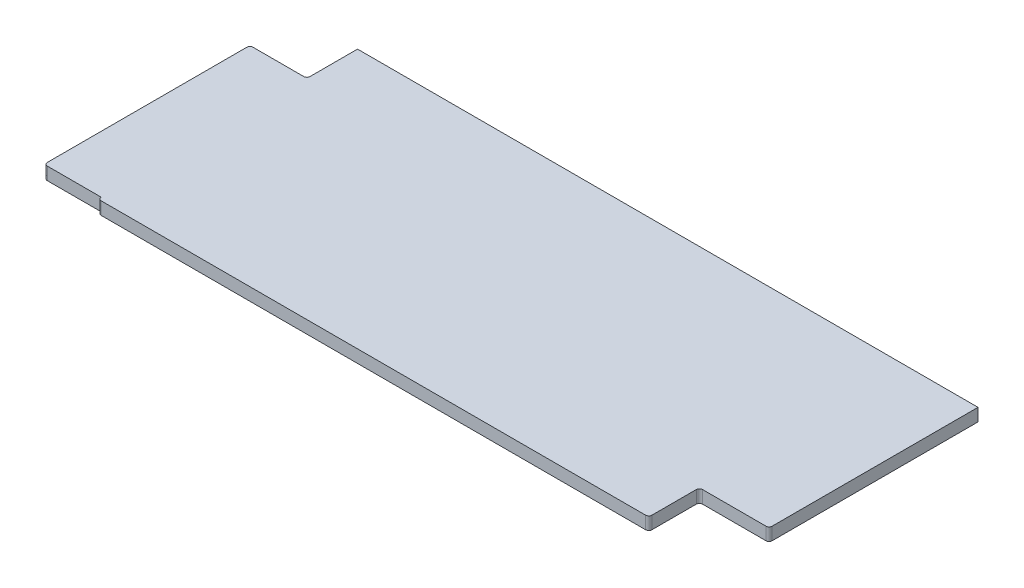
ISO-10303-21;
HEADER;
FILE_DESCRIPTION(('STEP AP214'),'2;1');
FILE_NAME('part.step','',(''),(''),'','','');
FILE_SCHEMA(('AUTOMOTIVE_DESIGN { 1 0 10303 214 1 1 1 1 }'));
ENDSEC;
DATA;
#1=APPLICATION_CONTEXT('core data for automotive mechanical design processes');
#2=APPLICATION_PROTOCOL_DEFINITION('international standard','automotive_design',2000,#1);
#3=PRODUCT_CONTEXT('',#1,'mechanical');
#4=PRODUCT('Part','Part','',(#3));
#5=PRODUCT_RELATED_PRODUCT_CATEGORY('part','',(#4));
#6=PRODUCT_DEFINITION_FORMATION('','',#4);
#7=PRODUCT_DEFINITION_CONTEXT('part definition',#1,'design');
#8=PRODUCT_DEFINITION('design','',#6,#7);
#9=PRODUCT_DEFINITION_SHAPE('','',#8);
#10=(LENGTH_UNIT() NAMED_UNIT(*) SI_UNIT(.MILLI.,.METRE.));
#11=(NAMED_UNIT(*) PLANE_ANGLE_UNIT() SI_UNIT($,.RADIAN.));
#12=(NAMED_UNIT(*) SI_UNIT($,.STERADIAN.) SOLID_ANGLE_UNIT());
#13=UNCERTAINTY_MEASURE_WITH_UNIT(LENGTH_MEASURE(1.E-05),#10,'distance_accuracy_value','');
#14=(GEOMETRIC_REPRESENTATION_CONTEXT(3) GLOBAL_UNCERTAINTY_ASSIGNED_CONTEXT((#13)) GLOBAL_UNIT_ASSIGNED_CONTEXT((#10,
#11,#12)) REPRESENTATION_CONTEXT('',''));
#15=CARTESIAN_POINT('',(0.,0.,0.));
#16=DIRECTION('',(0.,0.,1.));
#17=DIRECTION('',(1.,0.,0.));
#18=AXIS2_PLACEMENT_3D('',#15,#16,#17);
#19=CARTESIAN_POINT('',(-22.,4.,0.));
#20=DIRECTION('',(-1.,0.,0.));
#21=DIRECTION('',(0.,0.,1.));
#22=AXIS2_PLACEMENT_3D('',#19,#20,#21);
#23=PLANE('',#22);
#24=DIRECTION('',(0.,0.,-1.));
#25=VECTOR('',#24,1.);
#26=CARTESIAN_POINT('',(-22.,4.,0.));
#27=LINE('',#26,#25);
#28=CARTESIAN_POINT('',(-22.,4.,81.));
#29=VERTEX_POINT('',#28);
#30=CARTESIAN_POINT('',(-22.,4.,67.));
#31=VERTEX_POINT('',#30);
#32=EDGE_CURVE('E270',#29,#31,#27,.T.);
#33=ORIENTED_EDGE('',*,*,#32,.F.);
#34=DIRECTION('',(0.,-1.,0.));
#35=VECTOR('',#34,1.);
#36=CARTESIAN_POINT('',(-22.,4.,81.));
#37=LINE('',#36,#35);
#38=CARTESIAN_POINT('',(-22.,0.,81.));
#39=VERTEX_POINT('',#38);
#40=EDGE_CURVE('E242',#29,#39,#37,.T.);
#41=ORIENTED_EDGE('',*,*,#40,.T.);
#42=DIRECTION('',(0.,0.,-1.));
#43=VECTOR('',#42,1.);
#44=CARTESIAN_POINT('',(-22.,0.,0.));
#45=LINE('',#44,#43);
#46=CARTESIAN_POINT('',(-22.,0.,67.));
#47=VERTEX_POINT('',#46);
#48=EDGE_CURVE('E256',#39,#47,#45,.T.);
#49=ORIENTED_EDGE('',*,*,#48,.T.);
#50=DIRECTION('',(0.,-1.,0.));
#51=VECTOR('',#50,1.);
#52=CARTESIAN_POINT('',(-22.,4.,67.));
#53=LINE('',#52,#51);
#54=EDGE_CURVE('E239',#47,#31,#53,.F.);
#55=ORIENTED_EDGE('',*,*,#54,.T.);
#56=EDGE_LOOP('',(#33,#41,#49,#55));
#57=FACE_BOUND('',#56,.T.);
#58=ADVANCED_FACE('F41',(#57),#23,.F.);
#59=CARTESIAN_POINT('',(0.,4.,66.));
#60=DIRECTION('',(0.,0.,-1.));
#61=DIRECTION('',(-1.,0.,0.));
#62=AXIS2_PLACEMENT_3D('',#59,#60,#61);
#63=PLANE('',#62);
#64=DIRECTION('',(1.,0.,0.));
#65=VECTOR('',#64,1.);
#66=CARTESIAN_POINT('',(0.,0.,66.));
#67=LINE('',#66,#65);
#68=CARTESIAN_POINT('',(-21.,0.,66.));
#69=VERTEX_POINT('',#68);
#70=CARTESIAN_POINT('',(-0.999999999999992,0.,66.));
#71=VERTEX_POINT('',#70);
#72=EDGE_CURVE('E257',#69,#71,#67,.T.);
#73=ORIENTED_EDGE('',*,*,#72,.T.);
#74=DIRECTION('',(0.,-1.,0.));
#75=VECTOR('',#74,1.);
#76=CARTESIAN_POINT('',(-0.999999999999992,4.,66.));
#77=LINE('',#76,#75);
#78=CARTESIAN_POINT('',(-0.999999999999992,4.,66.));
#79=VERTEX_POINT('',#78);
#80=EDGE_CURVE('E236',#71,#79,#77,.F.);
#81=ORIENTED_EDGE('',*,*,#80,.T.);
#82=DIRECTION('',(1.,0.,0.));
#83=VECTOR('',#82,1.);
#84=CARTESIAN_POINT('',(0.,4.,66.));
#85=LINE('',#84,#83);
#86=CARTESIAN_POINT('',(-21.,4.,66.));
#87=VERTEX_POINT('',#86);
#88=EDGE_CURVE('E268',#87,#79,#85,.T.);
#89=ORIENTED_EDGE('',*,*,#88,.F.);
#90=DIRECTION('',(0.,-1.,0.));
#91=VECTOR('',#90,1.);
#92=CARTESIAN_POINT('',(-21.,0.,66.));
#93=LINE('',#92,#91);
#94=EDGE_CURVE('E233',#87,#69,#93,.T.);
#95=ORIENTED_EDGE('',*,*,#94,.T.);
#96=EDGE_LOOP('',(#73,#81,#89,#95));
#97=FACE_BOUND('',#96,.T.);
#98=ADVANCED_FACE('F272',(#97),#63,.F.);
#99=CARTESIAN_POINT('',(0.,4.,0.));
#100=DIRECTION('',(1.,0.,0.));
#101=DIRECTION('',(0.,0.,-1.));
#102=AXIS2_PLACEMENT_3D('',#99,#100,#101);
#103=PLANE('',#102);
#104=DIRECTION('',(0.,0.,1.));
#105=VECTOR('',#104,1.);
#106=CARTESIAN_POINT('',(0.,4.,0.));
#107=LINE('',#106,#105);
#108=CARTESIAN_POINT('',(0.,4.,0.));
#109=VERTEX_POINT('',#108);
#110=CARTESIAN_POINT('',(0.,4.,65.));
#111=VERTEX_POINT('',#110);
#112=EDGE_CURVE('E275',#109,#111,#107,.T.);
#113=ORIENTED_EDGE('',*,*,#112,.T.);
#114=DIRECTION('',(0.,-1.,0.));
#115=VECTOR('',#114,1.);
#116=CARTESIAN_POINT('',(0.,0.,65.));
#117=LINE('',#116,#115);
#118=CARTESIAN_POINT('',(0.,0.,65.));
#119=VERTEX_POINT('',#118);
#120=EDGE_CURVE('E229',#111,#119,#117,.T.);
#121=ORIENTED_EDGE('',*,*,#120,.T.);
#122=DIRECTION('',(0.,0.,1.));
#123=VECTOR('',#122,1.);
#124=CARTESIAN_POINT('',(0.,0.,0.));
#125=LINE('',#124,#123);
#126=CARTESIAN_POINT('',(0.,0.,0.));
#127=VERTEX_POINT('',#126);
#128=EDGE_CURVE('E298',#127,#119,#125,.T.);
#129=ORIENTED_EDGE('',*,*,#128,.F.);
#130=DIRECTION('',(0.,-1.,0.));
#131=VECTOR('',#130,1.);
#132=CARTESIAN_POINT('',(0.,4.,0.));
#133=LINE('',#132,#131);
#134=EDGE_CURVE('E314',#109,#127,#133,.T.);
#135=ORIENTED_EDGE('',*,*,#134,.F.);
#136=EDGE_LOOP('',(#113,#121,#129,#135));
#137=FACE_BOUND('',#136,.T.);
#138=ADVANCED_FACE('F348',(#137),#103,.T.);
#139=CARTESIAN_POINT('',(0.,4.,0.));
#140=DIRECTION('',(0.,0.,1.));
#141=DIRECTION('',(1.,0.,0.));
#142=AXIS2_PLACEMENT_3D('',#139,#140,#141);
#143=PLANE('',#142);
#144=DIRECTION('',(-1.,0.,0.));
#145=VECTOR('',#144,1.);
#146=CARTESIAN_POINT('',(0.,0.,0.));
#147=LINE('',#146,#145);
#148=CARTESIAN_POINT('',(-196.,0.,0.));
#149=VERTEX_POINT('',#148);
#150=EDGE_CURVE('E301',#127,#149,#147,.T.);
#151=ORIENTED_EDGE('',*,*,#150,.T.);
#152=DIRECTION('',(0.,-1.,0.));
#153=VECTOR('',#152,1.);
#154=CARTESIAN_POINT('',(-196.,4.,0.));
#155=LINE('',#154,#153);
#156=CARTESIAN_POINT('',(-196.,4.,0.));
#157=VERTEX_POINT('',#156);
#158=EDGE_CURVE('E294',#157,#149,#155,.T.);
#159=ORIENTED_EDGE('',*,*,#158,.F.);
#160=DIRECTION('',(-1.,0.,0.));
#161=VECTOR('',#160,1.);
#162=CARTESIAN_POINT('',(0.,4.,0.));
#163=LINE('',#162,#161);
#164=EDGE_CURVE('E280',#109,#157,#163,.T.);
#165=ORIENTED_EDGE('',*,*,#164,.F.);
#166=ORIENTED_EDGE('',*,*,#134,.T.);
#167=EDGE_LOOP('',(#151,#159,#165,#166));
#168=FACE_BOUND('',#167,.T.);
#169=ADVANCED_FACE('F339',(#168),#143,.F.);
#170=CARTESIAN_POINT('',(-196.,4.,0.));
#171=DIRECTION('',(1.,0.,0.));
#172=DIRECTION('',(0.,0.,-1.));
#173=AXIS2_PLACEMENT_3D('',#170,#171,#172);
#174=PLANE('',#173);
#175=DIRECTION('',(0.,0.,1.));
#176=VECTOR('',#175,1.);
#177=CARTESIAN_POINT('',(-196.,0.,0.));
#178=LINE('',#177,#176);
#179=CARTESIAN_POINT('',(-196.,0.,15.));
#180=VERTEX_POINT('',#179);
#181=EDGE_CURVE('E304',#149,#180,#178,.T.);
#182=ORIENTED_EDGE('',*,*,#181,.T.);
#183=DIRECTION('',(0.,1.,0.));
#184=VECTOR('',#183,1.);
#185=CARTESIAN_POINT('',(-196.,4.,15.));
#186=LINE('',#185,#184);
#187=CARTESIAN_POINT('',(-196.,4.,15.));
#188=VERTEX_POINT('',#187);
#189=EDGE_CURVE('E217',#180,#188,#186,.T.);
#190=ORIENTED_EDGE('',*,*,#189,.T.);
#191=DIRECTION('',(0.,0.,1.));
#192=VECTOR('',#191,1.);
#193=CARTESIAN_POINT('',(-196.,4.,0.));
#194=LINE('',#193,#192);
#195=EDGE_CURVE('E288',#157,#188,#194,.T.);
#196=ORIENTED_EDGE('',*,*,#195,.F.);
#197=ORIENTED_EDGE('',*,*,#158,.T.);
#198=EDGE_LOOP('',(#182,#190,#196,#197));
#199=FACE_BOUND('',#198,.T.);
#200=ADVANCED_FACE('F332',(#199),#174,.F.);
#201=CARTESIAN_POINT('',(0.,4.,82.));
#202=DIRECTION('',(0.,0.,-1.));
#203=DIRECTION('',(-1.,0.,0.));
#204=AXIS2_PLACEMENT_3D('',#201,#202,#203);
#205=PLANE('',#204);
#206=DIRECTION('',(1.,0.,0.));
#207=VECTOR('',#206,1.);
#208=CARTESIAN_POINT('',(0.,4.,82.));
#209=LINE('',#208,#207);
#210=CARTESIAN_POINT('',(-195.,4.,82.));
#211=VERTEX_POINT('',#210);
#212=CARTESIAN_POINT('',(-23.,4.,82.));
#213=VERTEX_POINT('',#212);
#214=EDGE_CURVE('E292',#211,#213,#209,.T.);
#215=ORIENTED_EDGE('',*,*,#214,.F.);
#216=DIRECTION('',(0.,-1.,0.));
#217=VECTOR('',#216,1.);
#218=CARTESIAN_POINT('',(-195.,4.,82.));
#219=LINE('',#218,#217);
#220=CARTESIAN_POINT('',(-195.,0.,82.));
#221=VERTEX_POINT('',#220);
#222=EDGE_CURVE('E182',#211,#221,#219,.T.);
#223=ORIENTED_EDGE('',*,*,#222,.T.);
#224=DIRECTION('',(1.,0.,0.));
#225=VECTOR('',#224,1.);
#226=CARTESIAN_POINT('',(0.,0.,82.));
#227=LINE('',#226,#225);
#228=CARTESIAN_POINT('',(-23.,0.,82.));
#229=VERTEX_POINT('',#228);
#230=EDGE_CURVE('E282',#221,#229,#227,.T.);
#231=ORIENTED_EDGE('',*,*,#230,.T.);
#232=DIRECTION('',(0.,-1.,0.));
#233=VECTOR('',#232,1.);
#234=CARTESIAN_POINT('',(-23.,4.,82.));
#235=LINE('',#234,#233);
#236=EDGE_CURVE('E224',#229,#213,#235,.F.);
#237=ORIENTED_EDGE('',*,*,#236,.T.);
#238=EDGE_LOOP('',(#215,#223,#231,#237));
#239=FACE_BOUND('',#238,.T.);
#240=ADVANCED_FACE('F330',(#239),#205,.F.);
#241=CARTESIAN_POINT('',(0.,4.,0.));
#242=DIRECTION('',(0.,1.,0.));
#243=DIRECTION('',(0.,0.,1.));
#244=AXIS2_PLACEMENT_3D('',#241,#242,#243);
#245=PLANE('',#244);
#246=DIRECTION('',(-1.,0.,0.));
#247=VECTOR('',#246,1.);
#248=CARTESIAN_POINT('',(-196.,4.,16.));
#249=LINE('',#248,#247);
#250=CARTESIAN_POINT('',(-197.,4.,16.));
#251=VERTEX_POINT('',#250);
#252=CARTESIAN_POINT('',(-213.,4.,16.));
#253=VERTEX_POINT('',#252);
#254=EDGE_CURVE('E507',#251,#253,#249,.T.);
#255=ORIENTED_EDGE('',*,*,#254,.T.);
#256=CARTESIAN_POINT('',(-213.,4.,17.));
#257=DIRECTION('',(0.,1.,0.));
#258=DIRECTION('',(0.,0.,1.));
#259=AXIS2_PLACEMENT_3D('',#256,#257,#258);
#260=CIRCLE('',#259,1.);
#261=CARTESIAN_POINT('',(-214.,4.,17.));
#262=VERTEX_POINT('',#261);
#263=EDGE_CURVE('E188',#253,#262,#260,.T.);
#264=ORIENTED_EDGE('',*,*,#263,.T.);
#265=DIRECTION('',(0.,0.,1.));
#266=VECTOR('',#265,1.);
#267=CARTESIAN_POINT('',(-214.,4.,16.));
#268=LINE('',#267,#266);
#269=CARTESIAN_POINT('',(-214.,4.,80.));
#270=VERTEX_POINT('',#269);
#271=EDGE_CURVE('E168',#262,#270,#268,.T.);
#272=ORIENTED_EDGE('',*,*,#271,.T.);
#273=CARTESIAN_POINT('',(-213.,4.,80.));
#274=DIRECTION('',(0.,1.,0.));
#275=DIRECTION('',(0.,0.,1.));
#276=AXIS2_PLACEMENT_3D('',#273,#274,#275);
#277=CIRCLE('',#276,1.);
#278=CARTESIAN_POINT('',(-213.,4.,81.));
#279=VERTEX_POINT('',#278);
#280=EDGE_CURVE('E163',#270,#279,#277,.T.);
#281=ORIENTED_EDGE('',*,*,#280,.T.);
#282=DIRECTION('',(1.,0.,0.));
#283=VECTOR('',#282,1.);
#284=CARTESIAN_POINT('',(-196.,4.,81.));
#285=LINE('',#284,#283);
#286=CARTESIAN_POINT('',(-196.,4.,81.));
#287=VERTEX_POINT('',#286);
#288=EDGE_CURVE('E154',#279,#287,#285,.T.);
#289=ORIENTED_EDGE('',*,*,#288,.T.);
#290=CARTESIAN_POINT('',(-195.,4.,81.));
#291=DIRECTION('',(0.,1.,0.));
#292=DIRECTION('',(0.,0.,1.));
#293=AXIS2_PLACEMENT_3D('',#290,#291,#292);
#294=CIRCLE('',#293,1.);
#295=EDGE_CURVE('E160',#287,#211,#294,.T.);
#296=ORIENTED_EDGE('',*,*,#295,.T.);
#297=ORIENTED_EDGE('',*,*,#214,.T.);
#298=CARTESIAN_POINT('',(-23.,4.,81.));
#299=DIRECTION('',(0.,1.,0.));
#300=DIRECTION('',(0.,0.,1.));
#301=AXIS2_PLACEMENT_3D('',#298,#299,#300);
#302=CIRCLE('',#301,1.);
#303=EDGE_CURVE('E190',#213,#29,#302,.T.);
#304=ORIENTED_EDGE('',*,*,#303,.T.);
#305=ORIENTED_EDGE('',*,*,#32,.T.);
#306=CARTESIAN_POINT('',(-21.,4.,67.));
#307=DIRECTION('',(0.,1.,0.));
#308=DIRECTION('',(0.,0.,1.));
#309=AXIS2_PLACEMENT_3D('',#306,#307,#308);
#310=CIRCLE('',#309,1.);
#311=EDGE_CURVE('E11',#31,#87,#310,.F.);
#312=ORIENTED_EDGE('',*,*,#311,.T.);
#313=ORIENTED_EDGE('',*,*,#88,.T.);
#314=CARTESIAN_POINT('',(-0.999999999999992,4.,65.));
#315=DIRECTION('',(0.,1.,0.));
#316=DIRECTION('',(0.,0.,1.));
#317=AXIS2_PLACEMENT_3D('',#314,#315,#316);
#318=CIRCLE('',#317,1.);
#319=EDGE_CURVE('E184',#79,#111,#318,.T.);
#320=ORIENTED_EDGE('',*,*,#319,.T.);
#321=ORIENTED_EDGE('',*,*,#112,.F.);
#322=ORIENTED_EDGE('',*,*,#164,.T.);
#323=ORIENTED_EDGE('',*,*,#195,.T.);
#324=CARTESIAN_POINT('',(-197.,4.,15.));
#325=DIRECTION('',(0.,1.,0.));
#326=DIRECTION('',(0.,0.,1.));
#327=AXIS2_PLACEMENT_3D('',#324,#325,#326);
#328=CIRCLE('',#327,1.);
#329=EDGE_CURVE('E246',#188,#251,#328,.F.);
#330=ORIENTED_EDGE('',*,*,#329,.T.);
#331=EDGE_LOOP('',(#255,#264,#272,#281,#289,#296,#297,#304,#305,#312,#313,#320,#321,#322,#323,#330));
#332=FACE_BOUND('',#331,.T.);
#333=ADVANCED_FACE('F157',(#332),#245,.T.);
#334=CARTESIAN_POINT('',(0.,0.,0.));
#335=DIRECTION('',(0.,1.,0.));
#336=DIRECTION('',(0.,0.,1.));
#337=AXIS2_PLACEMENT_3D('',#334,#335,#336);
#338=PLANE('',#337);
#339=DIRECTION('',(0.,0.,-1.));
#340=VECTOR('',#339,1.);
#341=CARTESIAN_POINT('',(-214.,0.,16.));
#342=LINE('',#341,#340);
#343=CARTESIAN_POINT('',(-214.,0.,80.));
#344=VERTEX_POINT('',#343);
#345=CARTESIAN_POINT('',(-214.,0.,17.));
#346=VERTEX_POINT('',#345);
#347=EDGE_CURVE('E177',#344,#346,#342,.T.);
#348=ORIENTED_EDGE('',*,*,#347,.T.);
#349=CARTESIAN_POINT('',(-213.,0.,17.));
#350=DIRECTION('',(0.,1.,0.));
#351=DIRECTION('',(0.,0.,1.));
#352=AXIS2_PLACEMENT_3D('',#349,#350,#351);
#353=CIRCLE('',#352,1.);
#354=CARTESIAN_POINT('',(-213.,0.,16.));
#355=VERTEX_POINT('',#354);
#356=EDGE_CURVE('E214',#346,#355,#353,.F.);
#357=ORIENTED_EDGE('',*,*,#356,.T.);
#358=DIRECTION('',(1.,0.,0.));
#359=VECTOR('',#358,1.);
#360=CARTESIAN_POINT('',(-196.,0.,16.));
#361=LINE('',#360,#359);
#362=CARTESIAN_POINT('',(-197.,0.,16.));
#363=VERTEX_POINT('',#362);
#364=EDGE_CURVE('E263',#355,#363,#361,.T.);
#365=ORIENTED_EDGE('',*,*,#364,.T.);
#366=CARTESIAN_POINT('',(-197.,0.,15.));
#367=DIRECTION('',(0.,1.,0.));
#368=DIRECTION('',(0.,0.,1.));
#369=AXIS2_PLACEMENT_3D('',#366,#367,#368);
#370=CIRCLE('',#369,1.);
#371=EDGE_CURVE('E249',#363,#180,#370,.T.);
#372=ORIENTED_EDGE('',*,*,#371,.T.);
#373=ORIENTED_EDGE('',*,*,#181,.F.);
#374=ORIENTED_EDGE('',*,*,#150,.F.);
#375=ORIENTED_EDGE('',*,*,#128,.T.);
#376=CARTESIAN_POINT('',(-0.999999999999992,0.,65.));
#377=DIRECTION('',(0.,1.,0.));
#378=DIRECTION('',(0.,0.,1.));
#379=AXIS2_PLACEMENT_3D('',#376,#377,#378);
#380=CIRCLE('',#379,1.);
#381=EDGE_CURVE('E57',#119,#71,#380,.F.);
#382=ORIENTED_EDGE('',*,*,#381,.T.);
#383=ORIENTED_EDGE('',*,*,#72,.F.);
#384=CARTESIAN_POINT('',(-21.,0.,67.));
#385=DIRECTION('',(0.,1.,0.));
#386=DIRECTION('',(0.,0.,1.));
#387=AXIS2_PLACEMENT_3D('',#384,#385,#386);
#388=CIRCLE('',#387,1.);
#389=EDGE_CURVE('E50',#69,#47,#388,.T.);
#390=ORIENTED_EDGE('',*,*,#389,.T.);
#391=ORIENTED_EDGE('',*,*,#48,.F.);
#392=CARTESIAN_POINT('',(-23.,0.,81.));
#393=DIRECTION('',(0.,1.,0.));
#394=DIRECTION('',(0.,0.,1.));
#395=AXIS2_PLACEMENT_3D('',#392,#393,#394);
#396=CIRCLE('',#395,1.);
#397=EDGE_CURVE('E203',#39,#229,#396,.F.);
#398=ORIENTED_EDGE('',*,*,#397,.T.);
#399=ORIENTED_EDGE('',*,*,#230,.F.);
#400=CARTESIAN_POINT('',(-195.,0.,81.));
#401=DIRECTION('',(0.,1.,0.));
#402=DIRECTION('',(0.,0.,1.));
#403=AXIS2_PLACEMENT_3D('',#400,#401,#402);
#404=CIRCLE('',#403,1.);
#405=CARTESIAN_POINT('',(-196.,0.,81.));
#406=VERTEX_POINT('',#405);
#407=EDGE_CURVE('E208',#221,#406,#404,.F.);
#408=ORIENTED_EDGE('',*,*,#407,.T.);
#409=DIRECTION('',(-1.,0.,0.));
#410=VECTOR('',#409,1.);
#411=CARTESIAN_POINT('',(-196.,0.,81.));
#412=LINE('',#411,#410);
#413=CARTESIAN_POINT('',(-213.,0.,81.));
#414=VERTEX_POINT('',#413);
#415=EDGE_CURVE('E174',#406,#414,#412,.T.);
#416=ORIENTED_EDGE('',*,*,#415,.T.);
#417=CARTESIAN_POINT('',(-213.,0.,80.));
#418=DIRECTION('',(0.,1.,0.));
#419=DIRECTION('',(0.,0.,1.));
#420=AXIS2_PLACEMENT_3D('',#417,#418,#419);
#421=CIRCLE('',#420,1.);
#422=EDGE_CURVE('E211',#414,#344,#421,.F.);
#423=ORIENTED_EDGE('',*,*,#422,.T.);
#424=EDGE_LOOP('',(#348,#357,#365,#372,#373,#374,#375,#382,#383,#390,#391,#398,#399,#408,#416,#423));
#425=FACE_BOUND('',#424,.T.);
#426=ADVANCED_FACE('F255',(#425),#338,.F.);
#427=CARTESIAN_POINT('',(-196.,-67.446274915669,81.));
#428=DIRECTION('',(0.,0.,1.));
#429=DIRECTION('',(1.,0.,0.));
#430=AXIS2_PLACEMENT_3D('',#427,#428,#429);
#431=PLANE('',#430);
#432=ORIENTED_EDGE('',*,*,#288,.F.);
#433=DIRECTION('',(0.,1.,0.));
#434=VECTOR('',#433,1.);
#435=CARTESIAN_POINT('',(-213.,-67.446274915669,81.));
#436=LINE('',#435,#434);
#437=EDGE_CURVE('E221',#279,#414,#436,.F.);
#438=ORIENTED_EDGE('',*,*,#437,.T.);
#439=ORIENTED_EDGE('',*,*,#415,.F.);
#440=DIRECTION('',(0.,1.,0.));
#441=VECTOR('',#440,1.);
#442=CARTESIAN_POINT('',(-196.,-67.446274915669,81.));
#443=LINE('',#442,#441);
#444=EDGE_CURVE('E167',#406,#287,#443,.T.);
#445=ORIENTED_EDGE('',*,*,#444,.T.);
#446=EDGE_LOOP('',(#432,#438,#439,#445));
#447=FACE_BOUND('',#446,.T.);
#448=ADVANCED_FACE('F172',(#447),#431,.T.);
#449=CARTESIAN_POINT('',(-214.,-67.446274915669,16.));
#450=DIRECTION('',(-1.,0.,0.));
#451=DIRECTION('',(0.,0.,1.));
#452=AXIS2_PLACEMENT_3D('',#449,#450,#451);
#453=PLANE('',#452);
#454=ORIENTED_EDGE('',*,*,#271,.F.);
#455=DIRECTION('',(0.,1.,0.));
#456=VECTOR('',#455,1.);
#457=CARTESIAN_POINT('',(-214.,-67.446274915669,17.));
#458=LINE('',#457,#456);
#459=EDGE_CURVE('E200',#262,#346,#458,.F.);
#460=ORIENTED_EDGE('',*,*,#459,.T.);
#461=ORIENTED_EDGE('',*,*,#347,.F.);
#462=DIRECTION('',(0.,1.,0.));
#463=VECTOR('',#462,1.);
#464=CARTESIAN_POINT('',(-214.,-67.446274915669,80.));
#465=LINE('',#464,#463);
#466=EDGE_CURVE('E196',#344,#270,#465,.T.);
#467=ORIENTED_EDGE('',*,*,#466,.T.);
#468=EDGE_LOOP('',(#454,#460,#461,#467));
#469=FACE_BOUND('',#468,.T.);
#470=ADVANCED_FACE('F419',(#469),#453,.T.);
#471=CARTESIAN_POINT('',(-196.,-67.446274915669,16.));
#472=DIRECTION('',(0.,0.,-1.));
#473=DIRECTION('',(-1.,0.,0.));
#474=AXIS2_PLACEMENT_3D('',#471,#472,#473);
#475=PLANE('',#474);
#476=ORIENTED_EDGE('',*,*,#364,.F.);
#477=DIRECTION('',(0.,1.,0.));
#478=VECTOR('',#477,1.);
#479=CARTESIAN_POINT('',(-213.,-67.446274915669,16.));
#480=LINE('',#479,#478);
#481=EDGE_CURVE('E320',#355,#253,#480,.T.);
#482=ORIENTED_EDGE('',*,*,#481,.T.);
#483=ORIENTED_EDGE('',*,*,#254,.F.);
#484=DIRECTION('',(0.,1.,0.));
#485=VECTOR('',#484,1.);
#486=CARTESIAN_POINT('',(-197.,-67.446274915669,16.));
#487=LINE('',#486,#485);
#488=EDGE_CURVE('E317',#251,#363,#487,.F.);
#489=ORIENTED_EDGE('',*,*,#488,.T.);
#490=EDGE_LOOP('',(#476,#482,#483,#489));
#491=FACE_BOUND('',#490,.T.);
#492=ADVANCED_FACE('F356',(#491),#475,.T.);
#493=CARTESIAN_POINT('',(-213.,-67.446274915669,17.));
#494=DIRECTION('',(0.,1.,0.));
#495=DIRECTION('',(0.,0.,1.));
#496=AXIS2_PLACEMENT_3D('',#493,#494,#495);
#497=CYLINDRICAL_SURFACE('',#496,1.);
#498=ORIENTED_EDGE('',*,*,#356,.F.);
#499=ORIENTED_EDGE('',*,*,#459,.F.);
#500=ORIENTED_EDGE('',*,*,#263,.F.);
#501=ORIENTED_EDGE('',*,*,#481,.F.);
#502=EDGE_LOOP('',(#498,#499,#500,#501));
#503=FACE_BOUND('',#502,.T.);
#504=ADVANCED_FACE('F352',(#503),#497,.T.);
#505=CARTESIAN_POINT('',(-197.,4.,15.));
#506=DIRECTION('',(0.,1.,0.));
#507=DIRECTION('',(0.,0.,1.));
#508=AXIS2_PLACEMENT_3D('',#505,#506,#507);
#509=CYLINDRICAL_SURFACE('',#508,1.);
#510=ORIENTED_EDGE('',*,*,#371,.F.);
#511=ORIENTED_EDGE('',*,*,#488,.F.);
#512=ORIENTED_EDGE('',*,*,#329,.F.);
#513=ORIENTED_EDGE('',*,*,#189,.F.);
#514=EDGE_LOOP('',(#510,#511,#512,#513));
#515=FACE_BOUND('',#514,.T.);
#516=ADVANCED_FACE('F355',(#515),#509,.F.);
#517=CARTESIAN_POINT('',(-213.,-67.446274915669,80.));
#518=DIRECTION('',(0.,1.,0.));
#519=DIRECTION('',(0.,0.,1.));
#520=AXIS2_PLACEMENT_3D('',#517,#518,#519);
#521=CYLINDRICAL_SURFACE('',#520,1.);
#522=ORIENTED_EDGE('',*,*,#422,.F.);
#523=ORIENTED_EDGE('',*,*,#437,.F.);
#524=ORIENTED_EDGE('',*,*,#280,.F.);
#525=ORIENTED_EDGE('',*,*,#466,.F.);
#526=EDGE_LOOP('',(#522,#523,#524,#525));
#527=FACE_BOUND('',#526,.T.);
#528=ADVANCED_FACE('F360',(#527),#521,.T.);
#529=CARTESIAN_POINT('',(-195.,4.,81.));
#530=DIRECTION('',(0.,-1.,0.));
#531=DIRECTION('',(0.,0.,-1.));
#532=AXIS2_PLACEMENT_3D('',#529,#530,#531);
#533=CYLINDRICAL_SURFACE('',#532,1.);
#534=ORIENTED_EDGE('',*,*,#295,.F.);
#535=ORIENTED_EDGE('',*,*,#444,.F.);
#536=ORIENTED_EDGE('',*,*,#407,.F.);
#537=ORIENTED_EDGE('',*,*,#222,.F.);
#538=EDGE_LOOP('',(#534,#535,#536,#537));
#539=FACE_BOUND('',#538,.T.);
#540=ADVANCED_FACE('F180',(#539),#533,.T.);
#541=CARTESIAN_POINT('',(-0.999999999999992,4.,65.));
#542=DIRECTION('',(0.,1.,0.));
#543=DIRECTION('',(0.,0.,1.));
#544=AXIS2_PLACEMENT_3D('',#541,#542,#543);
#545=CYLINDRICAL_SURFACE('',#544,1.);
#546=ORIENTED_EDGE('',*,*,#319,.F.);
#547=ORIENTED_EDGE('',*,*,#80,.F.);
#548=ORIENTED_EDGE('',*,*,#381,.F.);
#549=ORIENTED_EDGE('',*,*,#120,.F.);
#550=EDGE_LOOP('',(#546,#547,#548,#549));
#551=FACE_BOUND('',#550,.T.);
#552=ADVANCED_FACE('F367',(#551),#545,.T.);
#553=CARTESIAN_POINT('',(-23.,4.,81.));
#554=DIRECTION('',(0.,-1.,0.));
#555=DIRECTION('',(0.,0.,-1.));
#556=AXIS2_PLACEMENT_3D('',#553,#554,#555);
#557=CYLINDRICAL_SURFACE('',#556,1.);
#558=ORIENTED_EDGE('',*,*,#303,.F.);
#559=ORIENTED_EDGE('',*,*,#236,.F.);
#560=ORIENTED_EDGE('',*,*,#397,.F.);
#561=ORIENTED_EDGE('',*,*,#40,.F.);
#562=EDGE_LOOP('',(#558,#559,#560,#561));
#563=FACE_BOUND('',#562,.T.);
#564=ADVANCED_FACE('F327',(#563),#557,.T.);
#565=CARTESIAN_POINT('',(-21.,4.,67.));
#566=DIRECTION('',(0.,1.,0.));
#567=DIRECTION('',(0.,0.,1.));
#568=AXIS2_PLACEMENT_3D('',#565,#566,#567);
#569=CYLINDRICAL_SURFACE('',#568,1.);
#570=ORIENTED_EDGE('',*,*,#311,.F.);
#571=ORIENTED_EDGE('',*,*,#54,.F.);
#572=ORIENTED_EDGE('',*,*,#389,.F.);
#573=ORIENTED_EDGE('',*,*,#94,.F.);
#574=EDGE_LOOP('',(#570,#571,#572,#573));
#575=FACE_BOUND('',#574,.T.);
#576=ADVANCED_FACE('F43',(#575),#569,.F.);
#577=CLOSED_SHELL('',(#58,#98,#138,#169,#200,#240,#333,#426,#448,#470,#492,#504,#516,#528,#540,
#552,#564,#576));
#578=MANIFOLD_SOLID_BREP('B2',#577);
#579=ADVANCED_BREP_SHAPE_REPRESENTATION('',(#18,#578),#14);
#580=SHAPE_DEFINITION_REPRESENTATION(#9,#579);
ENDSEC;
END-ISO-10303-21;
